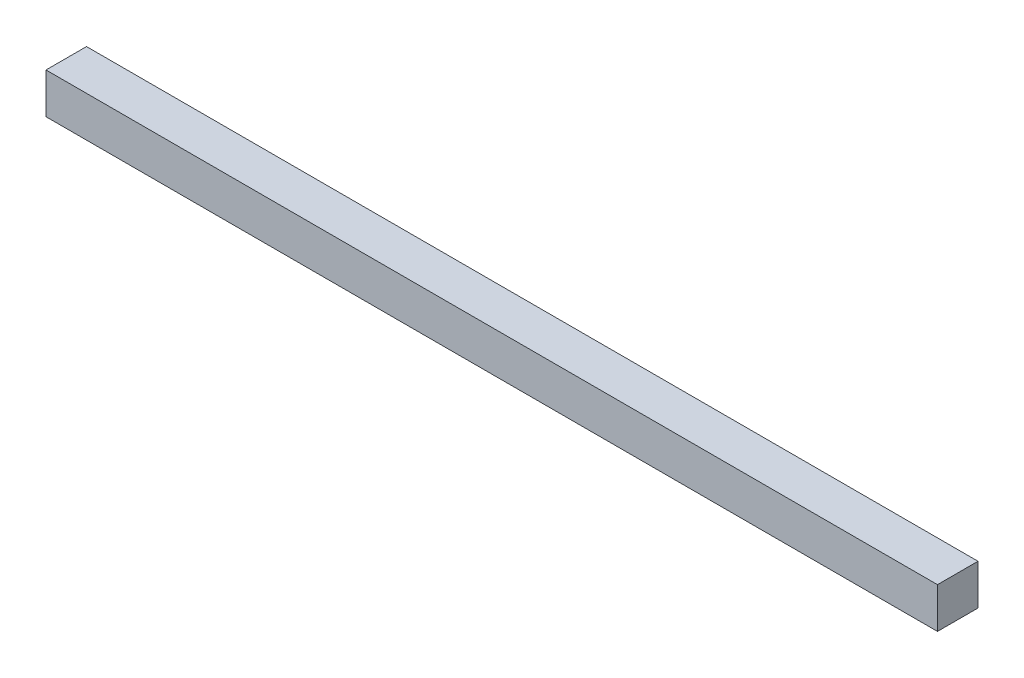
ISO-10303-21;
HEADER;
FILE_DESCRIPTION(('STEP AP214'),'2;1');
FILE_NAME('part.step','',(''),(''),'','','');
FILE_SCHEMA(('AUTOMOTIVE_DESIGN { 1 0 10303 214 1 1 1 1 }'));
ENDSEC;
DATA;
#1=APPLICATION_CONTEXT('core data for automotive mechanical design processes');
#2=APPLICATION_PROTOCOL_DEFINITION('international standard','automotive_design',2000,#1);
#3=PRODUCT_CONTEXT('',#1,'mechanical');
#4=PRODUCT('Part','Part','',(#3));
#5=PRODUCT_RELATED_PRODUCT_CATEGORY('part','',(#4));
#6=PRODUCT_DEFINITION_FORMATION('','',#4);
#7=PRODUCT_DEFINITION_CONTEXT('part definition',#1,'design');
#8=PRODUCT_DEFINITION('design','',#6,#7);
#9=PRODUCT_DEFINITION_SHAPE('','',#8);
#10=(LENGTH_UNIT() NAMED_UNIT(*) SI_UNIT(.MILLI.,.METRE.));
#11=(NAMED_UNIT(*) PLANE_ANGLE_UNIT() SI_UNIT($,.RADIAN.));
#12=(NAMED_UNIT(*) SI_UNIT($,.STERADIAN.) SOLID_ANGLE_UNIT());
#13=UNCERTAINTY_MEASURE_WITH_UNIT(LENGTH_MEASURE(1.E-05),#10,'distance_accuracy_value','');
#14=(GEOMETRIC_REPRESENTATION_CONTEXT(3) GLOBAL_UNCERTAINTY_ASSIGNED_CONTEXT((#13)) GLOBAL_UNIT_ASSIGNED_CONTEXT((#10,
#11,#12)) REPRESENTATION_CONTEXT('',''));
#15=CARTESIAN_POINT('',(0.,0.,0.));
#16=DIRECTION('',(0.,0.,1.));
#17=DIRECTION('',(1.,0.,0.));
#18=AXIS2_PLACEMENT_3D('',#15,#16,#17);
#19=CARTESIAN_POINT('',(1117.6,25.4,-25.4));
#20=DIRECTION('',(0.,0.,1.));
#21=DIRECTION('',(0.,-1.,0.));
#22=AXIS2_PLACEMENT_3D('',#19,#20,#21);
#23=PLANE('',#22);
#24=DIRECTION('',(0.,1.,0.));
#25=VECTOR('',#24,1.);
#26=CARTESIAN_POINT('',(0.,25.4,-25.4));
#27=LINE('',#26,#25);
#28=CARTESIAN_POINT('',(0.,-25.4,-25.4));
#29=VERTEX_POINT('',#28);
#30=CARTESIAN_POINT('',(0.,25.4,-25.4));
#31=VERTEX_POINT('',#30);
#32=EDGE_CURVE('E107',#29,#31,#27,.T.);
#33=ORIENTED_EDGE('',*,*,#32,.T.);
#34=DIRECTION('',(-1.,0.,0.));
#35=VECTOR('',#34,1.);
#36=CARTESIAN_POINT('',(1117.6,25.4,-25.4));
#37=LINE('',#36,#35);
#38=CARTESIAN_POINT('',(1117.6,25.4,-25.4));
#39=VERTEX_POINT('',#38);
#40=EDGE_CURVE('E11',#39,#31,#37,.T.);
#41=ORIENTED_EDGE('',*,*,#40,.F.);
#42=DIRECTION('',(0.,1.,0.));
#43=VECTOR('',#42,1.);
#44=CARTESIAN_POINT('',(1117.6,25.4,-25.4));
#45=LINE('',#44,#43);
#46=CARTESIAN_POINT('',(1117.6,-25.4,-25.4));
#47=VERTEX_POINT('',#46);
#48=EDGE_CURVE('E91',#47,#39,#45,.T.);
#49=ORIENTED_EDGE('',*,*,#48,.F.);
#50=DIRECTION('',(-1.,0.,0.));
#51=VECTOR('',#50,1.);
#52=CARTESIAN_POINT('',(1117.6,-25.4,-25.4));
#53=LINE('',#52,#51);
#54=EDGE_CURVE('E103',#47,#29,#53,.T.);
#55=ORIENTED_EDGE('',*,*,#54,.T.);
#56=EDGE_LOOP('',(#33,#41,#49,#55));
#57=FACE_BOUND('',#56,.T.);
#58=ADVANCED_FACE('F39',(#57),#23,.F.);
#59=CARTESIAN_POINT('',(1117.6,25.4,25.4));
#60=DIRECTION('',(0.,-1.,0.));
#61=DIRECTION('',(0.,0.,-1.));
#62=AXIS2_PLACEMENT_3D('',#59,#60,#61);
#63=PLANE('',#62);
#64=DIRECTION('',(0.,0.,1.));
#65=VECTOR('',#64,1.);
#66=CARTESIAN_POINT('',(0.,25.4,25.4));
#67=LINE('',#66,#65);
#68=CARTESIAN_POINT('',(0.,25.4,25.4));
#69=VERTEX_POINT('',#68);
#70=EDGE_CURVE('E96',#31,#69,#67,.T.);
#71=ORIENTED_EDGE('',*,*,#70,.T.);
#72=DIRECTION('',(-1.,0.,0.));
#73=VECTOR('',#72,1.);
#74=CARTESIAN_POINT('',(1117.6,25.4,25.4));
#75=LINE('',#74,#73);
#76=CARTESIAN_POINT('',(1117.6,25.4,25.4));
#77=VERTEX_POINT('',#76);
#78=EDGE_CURVE('E48',#77,#69,#75,.T.);
#79=ORIENTED_EDGE('',*,*,#78,.F.);
#80=DIRECTION('',(0.,0.,1.));
#81=VECTOR('',#80,1.);
#82=CARTESIAN_POINT('',(1117.6,25.4,25.4));
#83=LINE('',#82,#81);
#84=EDGE_CURVE('E86',#39,#77,#83,.T.);
#85=ORIENTED_EDGE('',*,*,#84,.F.);
#86=ORIENTED_EDGE('',*,*,#40,.T.);
#87=EDGE_LOOP('',(#71,#79,#85,#86));
#88=FACE_BOUND('',#87,.T.);
#89=ADVANCED_FACE('F95',(#88),#63,.F.);
#90=CARTESIAN_POINT('',(1117.6,25.4,25.4));
#91=DIRECTION('',(0.,0.,-1.));
#92=DIRECTION('',(0.,1.,0.));
#93=AXIS2_PLACEMENT_3D('',#90,#91,#92);
#94=PLANE('',#93);
#95=DIRECTION('',(0.,-1.,0.));
#96=VECTOR('',#95,1.);
#97=CARTESIAN_POINT('',(0.,25.4,25.4));
#98=LINE('',#97,#96);
#99=CARTESIAN_POINT('',(0.,-25.4,25.4));
#100=VERTEX_POINT('',#99);
#101=EDGE_CURVE('E73',#69,#100,#98,.T.);
#102=ORIENTED_EDGE('',*,*,#101,.T.);
#103=DIRECTION('',(-1.,0.,0.));
#104=VECTOR('',#103,1.);
#105=CARTESIAN_POINT('',(1117.6,-25.4,25.4));
#106=LINE('',#105,#104);
#107=CARTESIAN_POINT('',(1117.6,-25.4,25.4));
#108=VERTEX_POINT('',#107);
#109=EDGE_CURVE('E98',#108,#100,#106,.T.);
#110=ORIENTED_EDGE('',*,*,#109,.F.);
#111=DIRECTION('',(0.,-1.,0.));
#112=VECTOR('',#111,1.);
#113=CARTESIAN_POINT('',(1117.6,25.4,25.4));
#114=LINE('',#113,#112);
#115=EDGE_CURVE('E89',#77,#108,#114,.T.);
#116=ORIENTED_EDGE('',*,*,#115,.F.);
#117=ORIENTED_EDGE('',*,*,#78,.T.);
#118=EDGE_LOOP('',(#102,#110,#116,#117));
#119=FACE_BOUND('',#118,.T.);
#120=ADVANCED_FACE('F99',(#119),#94,.F.);
#121=CARTESIAN_POINT('',(1117.6,-25.4,25.4));
#122=DIRECTION('',(0.,1.,0.));
#123=DIRECTION('',(0.,0.,1.));
#124=AXIS2_PLACEMENT_3D('',#121,#122,#123);
#125=PLANE('',#124);
#126=DIRECTION('',(0.,0.,-1.));
#127=VECTOR('',#126,1.);
#128=CARTESIAN_POINT('',(0.,-25.4,25.4));
#129=LINE('',#128,#127);
#130=EDGE_CURVE('E79',#100,#29,#129,.T.);
#131=ORIENTED_EDGE('',*,*,#130,.T.);
#132=ORIENTED_EDGE('',*,*,#54,.F.);
#133=DIRECTION('',(0.,0.,-1.));
#134=VECTOR('',#133,1.);
#135=CARTESIAN_POINT('',(1117.6,-25.4,25.4));
#136=LINE('',#135,#134);
#137=EDGE_CURVE('E56',#108,#47,#136,.T.);
#138=ORIENTED_EDGE('',*,*,#137,.F.);
#139=ORIENTED_EDGE('',*,*,#109,.T.);
#140=EDGE_LOOP('',(#131,#132,#138,#139));
#141=FACE_BOUND('',#140,.T.);
#142=ADVANCED_FACE('F120',(#141),#125,.F.);
#143=CARTESIAN_POINT('',(1117.6,0.,0.));
#144=DIRECTION('',(1.,0.,0.));
#145=DIRECTION('',(0.,0.,-1.));
#146=AXIS2_PLACEMENT_3D('',#143,#144,#145);
#147=PLANE('',#146);
#148=ORIENTED_EDGE('',*,*,#48,.T.);
#149=ORIENTED_EDGE('',*,*,#84,.T.);
#150=ORIENTED_EDGE('',*,*,#115,.T.);
#151=ORIENTED_EDGE('',*,*,#137,.T.);
#152=EDGE_LOOP('',(#148,#149,#150,#151));
#153=FACE_BOUND('',#152,.T.);
#154=ADVANCED_FACE('F87',(#153),#147,.T.);
#155=CARTESIAN_POINT('',(0.,0.,0.));
#156=DIRECTION('',(1.,0.,0.));
#157=DIRECTION('',(0.,0.,-1.));
#158=AXIS2_PLACEMENT_3D('',#155,#156,#157);
#159=PLANE('',#158);
#160=ORIENTED_EDGE('',*,*,#32,.F.);
#161=ORIENTED_EDGE('',*,*,#130,.F.);
#162=ORIENTED_EDGE('',*,*,#101,.F.);
#163=ORIENTED_EDGE('',*,*,#70,.F.);
#164=EDGE_LOOP('',(#160,#161,#162,#163));
#165=FACE_BOUND('',#164,.T.);
#166=ADVANCED_FACE('F123',(#165),#159,.F.);
#167=CLOSED_SHELL('',(#58,#89,#120,#142,#154,#166));
#168=MANIFOLD_SOLID_BREP('B2',#167);
#169=ADVANCED_BREP_SHAPE_REPRESENTATION('',(#18,#168),#14);
#170=SHAPE_DEFINITION_REPRESENTATION(#9,#169);
ENDSEC;
END-ISO-10303-21;
